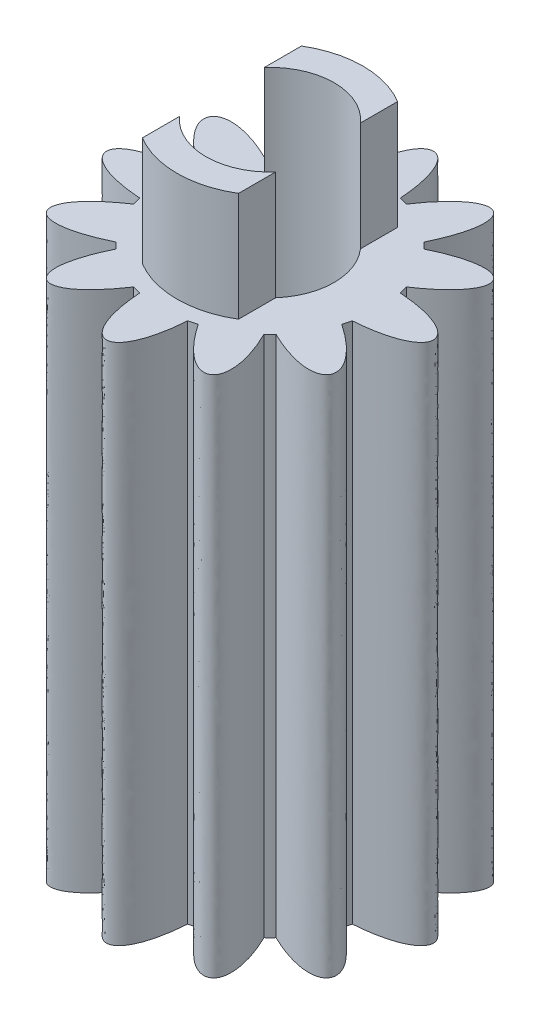
ISO-10303-21;
HEADER;
FILE_DESCRIPTION(('STEP AP214'),'2;1');
FILE_NAME('part.step','',(''),(''),'','','');
FILE_SCHEMA(('AUTOMOTIVE_DESIGN { 1 0 10303 214 1 1 1 1 }'));
ENDSEC;
DATA;
#1=APPLICATION_CONTEXT('core data for automotive mechanical design processes');
#2=APPLICATION_PROTOCOL_DEFINITION('international standard','automotive_design',2000,#1);
#3=PRODUCT_CONTEXT('',#1,'mechanical');
#4=PRODUCT('Part','Part','',(#3));
#5=PRODUCT_RELATED_PRODUCT_CATEGORY('part','',(#4));
#6=PRODUCT_DEFINITION_FORMATION('','',#4);
#7=PRODUCT_DEFINITION_CONTEXT('part definition',#1,'design');
#8=PRODUCT_DEFINITION('design','',#6,#7);
#9=PRODUCT_DEFINITION_SHAPE('','',#8);
#10=(LENGTH_UNIT() NAMED_UNIT(*) SI_UNIT(.MILLI.,.METRE.));
#11=(NAMED_UNIT(*) PLANE_ANGLE_UNIT() SI_UNIT($,.RADIAN.));
#12=(NAMED_UNIT(*) SI_UNIT($,.STERADIAN.) SOLID_ANGLE_UNIT());
#13=UNCERTAINTY_MEASURE_WITH_UNIT(LENGTH_MEASURE(1.E-05),#10,'distance_accuracy_value','');
#14=(GEOMETRIC_REPRESENTATION_CONTEXT(3) GLOBAL_UNCERTAINTY_ASSIGNED_CONTEXT((#13)) GLOBAL_UNIT_ASSIGNED_CONTEXT((#10,
#11,#12)) REPRESENTATION_CONTEXT('',''));
#15=CARTESIAN_POINT('',(0.,0.,0.));
#16=DIRECTION('',(0.,0.,1.));
#17=DIRECTION('',(1.,0.,0.));
#18=AXIS2_PLACEMENT_3D('',#15,#16,#17);
#19=CARTESIAN_POINT('',(0.,19.7,0.));
#20=DIRECTION('',(0.,-1.,0.));
#21=DIRECTION('',(0.,0.,-1.));
#22=AXIS2_PLACEMENT_3D('',#19,#20,#21);
#23=CYLINDRICAL_SURFACE('',#22,2.9);
#24=DIRECTION('',(0.,-1.,0.));
#25=VECTOR('',#24,1.);
#26=CARTESIAN_POINT('',(-1.5,19.7,-2.48193472919817));
#27=LINE('',#26,#25);
#28=CARTESIAN_POINT('',(-1.5,19.7,-2.48193472919817));
#29=VERTEX_POINT('',#28);
#30=CARTESIAN_POINT('',(-1.5,16.3,-2.48193472919817));
#31=VERTEX_POINT('',#30);
#32=EDGE_CURVE('E278',#29,#31,#27,.T.);
#33=ORIENTED_EDGE('',*,*,#32,.F.);
#34=CARTESIAN_POINT('',(0.,19.7,0.));
#35=DIRECTION('',(0.,1.,0.));
#36=DIRECTION('',(0.,0.,1.));
#37=AXIS2_PLACEMENT_3D('',#34,#35,#36);
#38=CIRCLE('',#37,2.9);
#39=CARTESIAN_POINT('',(1.5,19.7,-2.48193472919817));
#40=VERTEX_POINT('',#39);
#41=EDGE_CURVE('E270',#40,#29,#38,.T.);
#42=ORIENTED_EDGE('',*,*,#41,.F.);
#43=DIRECTION('',(0.,-1.,0.));
#44=VECTOR('',#43,1.);
#45=CARTESIAN_POINT('',(1.5,19.7,-2.48193472919817));
#46=LINE('',#45,#44);
#47=CARTESIAN_POINT('',(1.5,16.3,-2.48193472919817));
#48=VERTEX_POINT('',#47);
#49=EDGE_CURVE('E253',#48,#40,#46,.F.);
#50=ORIENTED_EDGE('',*,*,#49,.F.);
#51=CARTESIAN_POINT('',(0.,16.3,0.));
#52=DIRECTION('',(0.,1.,0.));
#53=DIRECTION('',(0.,0.,1.));
#54=AXIS2_PLACEMENT_3D('',#51,#52,#53);
#55=CIRCLE('',#54,2.9);
#56=EDGE_CURVE('E300',#48,#31,#55,.T.);
#57=ORIENTED_EDGE('',*,*,#56,.T.);
#58=EDGE_LOOP('',(#33,#42,#50,#57));
#59=FACE_BOUND('',#58,.T.);
#60=ADVANCED_FACE('F45',(#59),#23,.T.);
#61=DIRECTION('',(0.,-1.,0.));
#62=VECTOR('',#61,1.);
#63=CARTESIAN_POINT('',(-1.5,19.7,2.48193472919817));
#64=LINE('',#63,#62);
#65=CARTESIAN_POINT('',(-1.5,16.3,2.48193472919817));
#66=VERTEX_POINT('',#65);
#67=CARTESIAN_POINT('',(-1.5,19.7,2.48193472919817));
#68=VERTEX_POINT('',#67);
#69=EDGE_CURVE('E703',#66,#68,#64,.F.);
#70=ORIENTED_EDGE('',*,*,#69,.F.);
#71=CARTESIAN_POINT('',(1.5,16.3,2.48193472919817));
#72=VERTEX_POINT('',#71);
#73=EDGE_CURVE('E296',#66,#72,#55,.T.);
#74=ORIENTED_EDGE('',*,*,#73,.T.);
#75=DIRECTION('',(0.,-1.,0.));
#76=VECTOR('',#75,1.);
#77=CARTESIAN_POINT('',(1.5,19.7,2.48193472919817));
#78=LINE('',#77,#76);
#79=CARTESIAN_POINT('',(1.5,19.7,2.48193472919817));
#80=VERTEX_POINT('',#79);
#81=EDGE_CURVE('E262',#80,#72,#78,.T.);
#82=ORIENTED_EDGE('',*,*,#81,.F.);
#83=EDGE_CURVE('E281',#68,#80,#38,.T.);
#84=ORIENTED_EDGE('',*,*,#83,.F.);
#85=EDGE_LOOP('',(#70,#74,#82,#84));
#86=FACE_BOUND('',#85,.T.);
#87=ADVANCED_FACE('F841',(#86),#23,.T.);
#88=CARTESIAN_POINT('',(0.,19.7,0.));
#89=DIRECTION('',(0.,1.,0.));
#90=DIRECTION('',(0.,0.,1.));
#91=AXIS2_PLACEMENT_3D('',#88,#89,#90);
#92=PLANE('',#91);
#93=ORIENTED_EDGE('',*,*,#41,.T.);
#94=DIRECTION('',(0.,0.,-1.));
#95=VECTOR('',#94,1.);
#96=CARTESIAN_POINT('',(-1.5,19.7,-6.));
#97=LINE('',#96,#95);
#98=CARTESIAN_POINT('',(-1.5,19.7,-1.3228756555323));
#99=VERTEX_POINT('',#98);
#100=EDGE_CURVE('E693',#99,#29,#97,.T.);
#101=ORIENTED_EDGE('',*,*,#100,.F.);
#102=CARTESIAN_POINT('',(0.,19.7,0.));
#103=DIRECTION('',(0.,-1.,0.));
#104=DIRECTION('',(0.,0.,-1.));
#105=AXIS2_PLACEMENT_3D('',#102,#103,#104);
#106=CIRCLE('',#105,2.);
#107=CARTESIAN_POINT('',(1.5,19.7,-1.3228756555323));
#108=VERTEX_POINT('',#107);
#109=EDGE_CURVE('E272',#99,#108,#106,.T.);
#110=ORIENTED_EDGE('',*,*,#109,.T.);
#111=DIRECTION('',(0.,0.,1.));
#112=VECTOR('',#111,1.);
#113=CARTESIAN_POINT('',(1.5,19.7,-6.));
#114=LINE('',#113,#112);
#115=EDGE_CURVE('E256',#40,#108,#114,.T.);
#116=ORIENTED_EDGE('',*,*,#115,.F.);
#117=EDGE_LOOP('',(#93,#101,#110,#116));
#118=FACE_BOUND('',#117,.T.);
#119=ADVANCED_FACE('F268',(#118),#92,.T.);
#120=CARTESIAN_POINT('',(1.5,19.7,1.3228756555323));
#121=VERTEX_POINT('',#120);
#122=CARTESIAN_POINT('',(-1.5,19.7,1.3228756555323));
#123=VERTEX_POINT('',#122);
#124=EDGE_CURVE('E291',#121,#123,#106,.T.);
#125=ORIENTED_EDGE('',*,*,#124,.T.);
#126=EDGE_CURVE('E263',#68,#123,#97,.T.);
#127=ORIENTED_EDGE('',*,*,#126,.F.);
#128=ORIENTED_EDGE('',*,*,#83,.T.);
#129=EDGE_CURVE('E275',#121,#80,#114,.T.);
#130=ORIENTED_EDGE('',*,*,#129,.F.);
#131=EDGE_LOOP('',(#125,#127,#128,#130));
#132=FACE_BOUND('',#131,.T.);
#133=ADVANCED_FACE('F927',(#132),#92,.T.);
#134=CARTESIAN_POINT('',(0.,19.7,0.));
#135=DIRECTION('',(0.,-1.,0.));
#136=DIRECTION('',(0.,0.,-1.));
#137=AXIS2_PLACEMENT_3D('',#134,#135,#136);
#138=CYLINDRICAL_SURFACE('',#137,2.);
#139=CARTESIAN_POINT('',(0.,0.,0.));
#140=DIRECTION('',(0.,-1.,0.));
#141=DIRECTION('',(0.,0.,-1.));
#142=AXIS2_PLACEMENT_3D('',#139,#140,#141);
#143=CIRCLE('',#142,2.);
#144=CARTESIAN_POINT('',(0.,0.,-2.));
#145=VERTEX_POINT('',#144);
#146=EDGE_CURVE('E294',#145,#145,#143,.T.);
#147=ORIENTED_EDGE('',*,*,#146,.T.);
#148=EDGE_LOOP('',(#147));
#149=FACE_BOUND('',#148,.T.);
#150=DIRECTION('',(0.,-1.,0.));
#151=VECTOR('',#150,1.);
#152=CARTESIAN_POINT('',(-1.5,19.7,-1.3228756555323));
#153=LINE('',#152,#151);
#154=CARTESIAN_POINT('',(-1.5,16.3,-1.3228756555323));
#155=VERTEX_POINT('',#154);
#156=EDGE_CURVE('E11',#155,#99,#153,.F.);
#157=ORIENTED_EDGE('',*,*,#156,.F.);
#158=CARTESIAN_POINT('',(0.,16.3,0.));
#159=DIRECTION('',(0.,-1.,0.));
#160=DIRECTION('',(0.,0.,-1.));
#161=AXIS2_PLACEMENT_3D('',#158,#159,#160);
#162=CIRCLE('',#161,2.);
#163=CARTESIAN_POINT('',(-1.5,16.3,1.3228756555323));
#164=VERTEX_POINT('',#163);
#165=EDGE_CURVE('E669',#155,#164,#162,.F.);
#166=ORIENTED_EDGE('',*,*,#165,.T.);
#167=DIRECTION('',(0.,-1.,0.));
#168=VECTOR('',#167,1.);
#169=CARTESIAN_POINT('',(-1.5,19.7,1.3228756555323));
#170=LINE('',#169,#168);
#171=EDGE_CURVE('E55',#123,#164,#170,.T.);
#172=ORIENTED_EDGE('',*,*,#171,.F.);
#173=ORIENTED_EDGE('',*,*,#124,.F.);
#174=DIRECTION('',(0.,-1.,0.));
#175=VECTOR('',#174,1.);
#176=CARTESIAN_POINT('',(1.5,19.7,1.3228756555323));
#177=LINE('',#176,#175);
#178=CARTESIAN_POINT('',(1.5,16.3,1.3228756555323));
#179=VERTEX_POINT('',#178);
#180=EDGE_CURVE('E666',#179,#121,#177,.F.);
#181=ORIENTED_EDGE('',*,*,#180,.F.);
#182=CARTESIAN_POINT('',(0.,16.3,0.));
#183=DIRECTION('',(0.,-1.,0.));
#184=DIRECTION('',(0.,0.,-1.));
#185=AXIS2_PLACEMENT_3D('',#182,#183,#184);
#186=CIRCLE('',#185,2.);
#187=CARTESIAN_POINT('',(1.5,16.3,-1.3228756555323));
#188=VERTEX_POINT('',#187);
#189=EDGE_CURVE('E659',#179,#188,#186,.F.);
#190=ORIENTED_EDGE('',*,*,#189,.T.);
#191=DIRECTION('',(0.,-1.,0.));
#192=VECTOR('',#191,1.);
#193=CARTESIAN_POINT('',(1.5,19.7,-1.3228756555323));
#194=LINE('',#193,#192);
#195=EDGE_CURVE('E663',#108,#188,#194,.T.);
#196=ORIENTED_EDGE('',*,*,#195,.F.);
#197=ORIENTED_EDGE('',*,*,#109,.F.);
#198=EDGE_LOOP('',(#157,#166,#172,#173,#181,#190,#196,#197));
#199=FACE_BOUND('',#198,.T.);
#200=ADVANCED_FACE('F682',(#149,#199),#138,.F.);
#201=CARTESIAN_POINT('',(0.,16.3,0.));
#202=DIRECTION('',(0.,-1.,0.));
#203=DIRECTION('',(0.,0.,-1.));
#204=AXIS2_PLACEMENT_3D('',#201,#202,#203);
#205=CYLINDRICAL_SURFACE('',#204,3.4);
#206=CARTESIAN_POINT('',(0.,0.,0.));
#207=DIRECTION('',(0.,1.,0.));
#208=DIRECTION('',(0.,0.,1.));
#209=AXIS2_PLACEMENT_3D('',#206,#207,#208);
#210=CIRCLE('',#209,3.4);
#211=CARTESIAN_POINT('',(0.749999999999977,0.,3.31624787975809));
#212=VERTEX_POINT('',#211);
#213=CARTESIAN_POINT('',(1.0086048870407,0.,3.24695490911679));
#214=VERTEX_POINT('',#213);
#215=EDGE_CURVE('E280',#212,#214,#210,.T.);
#216=ORIENTED_EDGE('',*,*,#215,.T.);
#217=DIRECTION('',(0.,-1.,0.));
#218=VECTOR('',#217,1.);
#219=CARTESIAN_POINT('',(1.0086048870407,16.3,3.24695490911679));
#220=LINE('',#219,#218);
#221=CARTESIAN_POINT('',(1.0086048870407,16.3,3.24695490911679));
#222=VERTEX_POINT('',#221);
#223=EDGE_CURVE('E301',#222,#214,#220,.T.);
#224=ORIENTED_EDGE('',*,*,#223,.F.);
#225=CARTESIAN_POINT('',(0.,16.3,0.));
#226=DIRECTION('',(0.,1.,0.));
#227=DIRECTION('',(0.,0.,1.));
#228=AXIS2_PLACEMENT_3D('',#225,#226,#227);
#229=CIRCLE('',#228,3.4);
#230=CARTESIAN_POINT('',(0.749999999999977,16.3,3.31624787975809));
#231=VERTEX_POINT('',#230);
#232=EDGE_CURVE('E302',#231,#222,#229,.T.);
#233=ORIENTED_EDGE('',*,*,#232,.F.);
#234=DIRECTION('',(0.,-1.,0.));
#235=VECTOR('',#234,1.);
#236=CARTESIAN_POINT('',(0.749999999999977,16.3,3.31624787975809));
#237=LINE('',#236,#235);
#238=EDGE_CURVE('E469',#231,#212,#237,.T.);
#239=ORIENTED_EDGE('',*,*,#238,.T.);
#240=EDGE_LOOP('',(#216,#224,#233,#239));
#241=FACE_BOUND('',#240,.T.);
#242=ADVANCED_FACE('F456',(#241),#205,.T.);
#243=CARTESIAN_POINT('',(2.30764299271736,16.3,2.4969549091168));
#244=CARTESIAN_POINT('',(3.35247350558122,16.3,4.63998777602861));
#245=CARTESIAN_POINT('',(2.34211053449937,16.3,5.22332110936194));
#246=CARTESIAN_POINT('',(1.0086048870407,16.3,3.24695490911679));
#247=B_SPLINE_CURVE_WITH_KNOTS('',3,(#243,#244,#245,#246),.UNSPECIFIED.,.F.,.F.,(4,4),(0.,1.),.UNSPECIFIED.);
#248=DIRECTION('',(0.,-1.,0.));
#249=VECTOR('',#248,1.);
#250=SURFACE_OF_LINEAR_EXTRUSION('',#247,#249);
#251=CARTESIAN_POINT('',(2.30764299271736,0.,2.4969549091168));
#252=CARTESIAN_POINT('',(3.35247350558122,0.,4.63998777602861));
#253=CARTESIAN_POINT('',(2.34211053449937,0.,5.22332110936194));
#254=CARTESIAN_POINT('',(1.0086048870407,0.,3.24695490911679));
#255=B_SPLINE_CURVE_WITH_KNOTS('',3,(#251,#252,#253,#254),.UNSPECIFIED.,.F.,.F.,(4,4),(0.,1.),.UNSPECIFIED.);
#256=CARTESIAN_POINT('',(2.30764299271736,0.,2.4969549091168));
#257=VERTEX_POINT('',#256);
#258=EDGE_CURVE('E286',#257,#214,#255,.T.);
#259=ORIENTED_EDGE('',*,*,#258,.F.);
#260=DIRECTION('',(0.,-1.,0.));
#261=VECTOR('',#260,1.);
#262=CARTESIAN_POINT('',(2.30764299271736,16.3,2.4969549091168));
#263=LINE('',#262,#261);
#264=CARTESIAN_POINT('',(2.30764299271736,16.3,2.4969549091168));
#265=VERTEX_POINT('',#264);
#266=EDGE_CURVE('E654',#265,#257,#263,.T.);
#267=ORIENTED_EDGE('',*,*,#266,.F.);
#268=EDGE_CURVE('E305',#265,#222,#247,.T.);
#269=ORIENTED_EDGE('',*,*,#268,.T.);
#270=ORIENTED_EDGE('',*,*,#223,.T.);
#271=EDGE_LOOP('',(#259,#267,#269,#270));
#272=FACE_BOUND('',#271,.T.);
#273=ADVANCED_FACE('F47',(#272),#250,.T.);
#274=CARTESIAN_POINT('',(2.49695490911677,0.,2.30764299271738));
#275=VERTEX_POINT('',#274);
#276=EDGE_CURVE('E289',#257,#275,#210,.T.);
#277=ORIENTED_EDGE('',*,*,#276,.T.);
#278=DIRECTION('',(0.,-1.,0.));
#279=VECTOR('',#278,1.);
#280=CARTESIAN_POINT('',(2.49695490911677,16.3,2.30764299271738));
#281=LINE('',#280,#279);
#282=CARTESIAN_POINT('',(2.49695490911677,16.3,2.30764299271738));
#283=VERTEX_POINT('',#282);
#284=EDGE_CURVE('E651',#283,#275,#281,.T.);
#285=ORIENTED_EDGE('',*,*,#284,.F.);
#286=EDGE_CURVE('E308',#265,#283,#229,.T.);
#287=ORIENTED_EDGE('',*,*,#286,.F.);
#288=ORIENTED_EDGE('',*,*,#266,.T.);
#289=EDGE_LOOP('',(#277,#285,#287,#288));
#290=FACE_BOUND('',#289,.T.);
#291=ADVANCED_FACE('F336',(#290),#205,.T.);
#292=CARTESIAN_POINT('',(3.24695490911678,16.3,1.00860488704073));
#293=CARTESIAN_POINT('',(5.22332110936191,16.3,2.34211053449942));
#294=CARTESIAN_POINT('',(4.63998777602857,16.3,3.35247350558126));
#295=CARTESIAN_POINT('',(2.49695490911677,16.3,2.30764299271738));
#296=B_SPLINE_CURVE_WITH_KNOTS('',3,(#292,#293,#294,#295),.UNSPECIFIED.,.F.,.F.,(4,4),(0.,1.),.UNSPECIFIED.);
#297=DIRECTION('',(0.,-1.,0.));
#298=VECTOR('',#297,1.);
#299=SURFACE_OF_LINEAR_EXTRUSION('',#296,#298);
#300=CARTESIAN_POINT('',(3.24695490911678,0.,1.00860488704073));
#301=CARTESIAN_POINT('',(5.22332110936191,0.,2.34211053449942));
#302=CARTESIAN_POINT('',(4.63998777602857,0.,3.35247350558126));
#303=CARTESIAN_POINT('',(2.49695490911677,0.,2.30764299271738));
#304=B_SPLINE_CURVE_WITH_KNOTS('',3,(#300,#301,#302,#303),.UNSPECIFIED.,.F.,.F.,(4,4),(0.,1.),.UNSPECIFIED.);
#305=CARTESIAN_POINT('',(3.24695490911678,0.,1.00860488704073));
#306=VERTEX_POINT('',#305);
#307=EDGE_CURVE('E479',#306,#275,#304,.T.);
#308=ORIENTED_EDGE('',*,*,#307,.F.);
#309=DIRECTION('',(0.,-1.,0.));
#310=VECTOR('',#309,1.);
#311=CARTESIAN_POINT('',(3.24695490911678,16.3,1.00860488704073));
#312=LINE('',#311,#310);
#313=CARTESIAN_POINT('',(3.24695490911678,16.3,1.00860488704073));
#314=VERTEX_POINT('',#313);
#315=EDGE_CURVE('E648',#314,#306,#312,.T.);
#316=ORIENTED_EDGE('',*,*,#315,.F.);
#317=EDGE_CURVE('E314',#314,#283,#296,.T.);
#318=ORIENTED_EDGE('',*,*,#317,.T.);
#319=ORIENTED_EDGE('',*,*,#284,.T.);
#320=EDGE_LOOP('',(#308,#316,#318,#319));
#321=FACE_BOUND('',#320,.T.);
#322=ADVANCED_FACE('F332',(#321),#299,.T.);
#323=CARTESIAN_POINT('',(3.31624787975808,0.,0.750000000000012));
#324=VERTEX_POINT('',#323);
#325=EDGE_CURVE('E488',#306,#324,#210,.T.);
#326=ORIENTED_EDGE('',*,*,#325,.T.);
#327=DIRECTION('',(0.,-1.,0.));
#328=VECTOR('',#327,1.);
#329=CARTESIAN_POINT('',(3.31624787975808,16.3,0.750000000000012));
#330=LINE('',#329,#328);
#331=CARTESIAN_POINT('',(3.31624787975808,16.3,0.750000000000012));
#332=VERTEX_POINT('',#331);
#333=EDGE_CURVE('E645',#332,#324,#330,.T.);
#334=ORIENTED_EDGE('',*,*,#333,.F.);
#335=EDGE_CURVE('E323',#314,#332,#229,.T.);
#336=ORIENTED_EDGE('',*,*,#335,.F.);
#337=ORIENTED_EDGE('',*,*,#315,.T.);
#338=EDGE_LOOP('',(#326,#334,#336,#337));
#339=FACE_BOUND('',#338,.T.);
#340=ADVANCED_FACE('F335',(#339),#205,.T.);
#341=CARTESIAN_POINT('',(3.31624787975809,16.3,-0.749999999999988));
#342=CARTESIAN_POINT('',(5.69458404008064,16.3,-0.583333333333314));
#343=CARTESIAN_POINT('',(5.69458404008063,16.3,0.583333333333354));
#344=CARTESIAN_POINT('',(3.31624787975808,16.3,0.750000000000011));
#345=B_SPLINE_CURVE_WITH_KNOTS('',3,(#341,#342,#343,#344),.UNSPECIFIED.,.F.,.F.,(4,4),(0.,1.),.UNSPECIFIED.);
#346=DIRECTION('',(0.,-1.,0.));
#347=VECTOR('',#346,1.);
#348=SURFACE_OF_LINEAR_EXTRUSION('',#345,#347);
#349=CARTESIAN_POINT('',(3.31624787975809,0.,-0.749999999999988));
#350=CARTESIAN_POINT('',(5.69458404008064,0.,-0.583333333333314));
#351=CARTESIAN_POINT('',(5.69458404008063,0.,0.583333333333354));
#352=CARTESIAN_POINT('',(3.31624787975808,0.,0.750000000000011));
#353=B_SPLINE_CURVE_WITH_KNOTS('',3,(#349,#350,#351,#352),.UNSPECIFIED.,.F.,.F.,(4,4),(0.,1.),.UNSPECIFIED.);
#354=CARTESIAN_POINT('',(3.31624787975809,0.,-0.749999999999988));
#355=VERTEX_POINT('',#354);
#356=EDGE_CURVE('E489',#355,#324,#353,.T.);
#357=ORIENTED_EDGE('',*,*,#356,.F.);
#358=DIRECTION('',(0.,-1.,0.));
#359=VECTOR('',#358,1.);
#360=CARTESIAN_POINT('',(3.31624787975809,16.3,-0.749999999999988));
#361=LINE('',#360,#359);
#362=CARTESIAN_POINT('',(3.31624787975809,16.3,-0.749999999999988));
#363=VERTEX_POINT('',#362);
#364=EDGE_CURVE('E642',#363,#355,#361,.T.);
#365=ORIENTED_EDGE('',*,*,#364,.F.);
#366=EDGE_CURVE('E324',#363,#332,#345,.T.);
#367=ORIENTED_EDGE('',*,*,#366,.T.);
#368=ORIENTED_EDGE('',*,*,#333,.T.);
#369=EDGE_LOOP('',(#357,#365,#367,#368));
#370=FACE_BOUND('',#369,.T.);
#371=ADVANCED_FACE('F338',(#370),#348,.T.);
#372=CARTESIAN_POINT('',(3.24695490911679,0.,-1.00860488704071));
#373=VERTEX_POINT('',#372);
#374=EDGE_CURVE('E498',#355,#373,#210,.T.);
#375=ORIENTED_EDGE('',*,*,#374,.T.);
#376=DIRECTION('',(0.,-1.,0.));
#377=VECTOR('',#376,1.);
#378=CARTESIAN_POINT('',(3.24695490911679,16.3,-1.00860488704071));
#379=LINE('',#378,#377);
#380=CARTESIAN_POINT('',(3.24695490911679,16.3,-1.00860488704071));
#381=VERTEX_POINT('',#380);
#382=EDGE_CURVE('E639',#381,#373,#379,.T.);
#383=ORIENTED_EDGE('',*,*,#382,.F.);
#384=EDGE_CURVE('E357',#363,#381,#229,.T.);
#385=ORIENTED_EDGE('',*,*,#384,.F.);
#386=ORIENTED_EDGE('',*,*,#364,.T.);
#387=EDGE_LOOP('',(#375,#383,#385,#386));
#388=FACE_BOUND('',#387,.T.);
#389=ADVANCED_FACE('F341',(#388),#205,.T.);
#390=CARTESIAN_POINT('',(2.49695490911679,16.3,-2.30764299271737));
#391=CARTESIAN_POINT('',(4.63998777602859,16.3,-3.35247350558123));
#392=CARTESIAN_POINT('',(5.22332110936193,16.3,-2.34211053449938));
#393=CARTESIAN_POINT('',(3.24695490911678,16.3,-1.00860488704071));
#394=B_SPLINE_CURVE_WITH_KNOTS('',3,(#390,#391,#392,#393),.UNSPECIFIED.,.F.,.F.,(4,4),(0.,1.),.UNSPECIFIED.);
#395=DIRECTION('',(0.,-1.,0.));
#396=VECTOR('',#395,1.);
#397=SURFACE_OF_LINEAR_EXTRUSION('',#394,#396);
#398=CARTESIAN_POINT('',(2.49695490911679,0.,-2.30764299271737));
#399=CARTESIAN_POINT('',(4.63998777602859,0.,-3.35247350558123));
#400=CARTESIAN_POINT('',(5.22332110936193,0.,-2.34211053449938));
#401=CARTESIAN_POINT('',(3.24695490911678,0.,-1.00860488704071));
#402=B_SPLINE_CURVE_WITH_KNOTS('',3,(#398,#399,#400,#401),.UNSPECIFIED.,.F.,.F.,(4,4),(0.,1.),.UNSPECIFIED.);
#403=CARTESIAN_POINT('',(2.49695490911679,0.,-2.30764299271737));
#404=VERTEX_POINT('',#403);
#405=EDGE_CURVE('E499',#404,#373,#402,.T.);
#406=ORIENTED_EDGE('',*,*,#405,.F.);
#407=DIRECTION('',(0.,-1.,0.));
#408=VECTOR('',#407,1.);
#409=CARTESIAN_POINT('',(2.49695490911679,16.3,-2.30764299271737));
#410=LINE('',#409,#408);
#411=CARTESIAN_POINT('',(2.49695490911679,16.3,-2.30764299271737));
#412=VERTEX_POINT('',#411);
#413=EDGE_CURVE('E636',#412,#404,#410,.T.);
#414=ORIENTED_EDGE('',*,*,#413,.F.);
#415=EDGE_CURVE('E351',#412,#381,#394,.T.);
#416=ORIENTED_EDGE('',*,*,#415,.T.);
#417=ORIENTED_EDGE('',*,*,#382,.T.);
#418=EDGE_LOOP('',(#406,#414,#416,#417));
#419=FACE_BOUND('',#418,.T.);
#420=ADVANCED_FACE('F343',(#419),#397,.T.);
#421=CARTESIAN_POINT('',(2.30764299271737,0.,-2.49695490911678));
#422=VERTEX_POINT('',#421);
#423=EDGE_CURVE('E508',#404,#422,#210,.T.);
#424=ORIENTED_EDGE('',*,*,#423,.T.);
#425=DIRECTION('',(0.,-1.,0.));
#426=VECTOR('',#425,1.);
#427=CARTESIAN_POINT('',(2.30764299271737,16.3,-2.49695490911678));
#428=LINE('',#427,#426);
#429=CARTESIAN_POINT('',(2.30764299271737,16.3,-2.49695490911678));
#430=VERTEX_POINT('',#429);
#431=EDGE_CURVE('E633',#430,#422,#428,.T.);
#432=ORIENTED_EDGE('',*,*,#431,.F.);
#433=EDGE_CURVE('E356',#412,#430,#229,.T.);
#434=ORIENTED_EDGE('',*,*,#433,.F.);
#435=ORIENTED_EDGE('',*,*,#413,.T.);
#436=EDGE_LOOP('',(#424,#432,#434,#435));
#437=FACE_BOUND('',#436,.T.);
#438=ADVANCED_FACE('F346',(#437),#205,.T.);
#439=CARTESIAN_POINT('',(1.00860488704072,16.3,-3.24695490911678));
#440=CARTESIAN_POINT('',(2.3421105344994,16.3,-5.22332110936192));
#441=CARTESIAN_POINT('',(3.35247350558125,16.3,-4.63998777602858));
#442=CARTESIAN_POINT('',(2.30764299271737,16.3,-2.49695490911678));
#443=B_SPLINE_CURVE_WITH_KNOTS('',3,(#439,#440,#441,#442),.UNSPECIFIED.,.F.,.F.,(4,4),(0.,1.),.UNSPECIFIED.);
#444=DIRECTION('',(0.,-1.,0.));
#445=VECTOR('',#444,1.);
#446=SURFACE_OF_LINEAR_EXTRUSION('',#443,#445);
#447=CARTESIAN_POINT('',(1.00860488704072,0.,-3.24695490911678));
#448=CARTESIAN_POINT('',(2.3421105344994,0.,-5.22332110936192));
#449=CARTESIAN_POINT('',(3.35247350558125,0.,-4.63998777602858));
#450=CARTESIAN_POINT('',(2.30764299271737,0.,-2.49695490911678));
#451=B_SPLINE_CURVE_WITH_KNOTS('',3,(#447,#448,#449,#450),.UNSPECIFIED.,.F.,.F.,(4,4),(0.,1.),.UNSPECIFIED.);
#452=CARTESIAN_POINT('',(1.00860488704072,0.,-3.24695490911678));
#453=VERTEX_POINT('',#452);
#454=EDGE_CURVE('E509',#453,#422,#451,.T.);
#455=ORIENTED_EDGE('',*,*,#454,.F.);
#456=DIRECTION('',(0.,-1.,0.));
#457=VECTOR('',#456,1.);
#458=CARTESIAN_POINT('',(1.00860488704072,16.3,-3.24695490911678));
#459=LINE('',#458,#457);
#460=CARTESIAN_POINT('',(1.00860488704072,16.3,-3.24695490911678));
#461=VERTEX_POINT('',#460);
#462=EDGE_CURVE('E630',#461,#453,#459,.T.);
#463=ORIENTED_EDGE('',*,*,#462,.F.);
#464=EDGE_CURVE('E358',#461,#430,#443,.T.);
#465=ORIENTED_EDGE('',*,*,#464,.T.);
#466=ORIENTED_EDGE('',*,*,#431,.T.);
#467=EDGE_LOOP('',(#455,#463,#465,#466));
#468=FACE_BOUND('',#467,.T.);
#469=ADVANCED_FACE('F348',(#468),#446,.T.);
#470=CARTESIAN_POINT('',(0.75,0.,-3.31624787975809));
#471=VERTEX_POINT('',#470);
#472=EDGE_CURVE('E518',#453,#471,#210,.T.);
#473=ORIENTED_EDGE('',*,*,#472,.T.);
#474=DIRECTION('',(0.,-1.,0.));
#475=VECTOR('',#474,1.);
#476=CARTESIAN_POINT('',(0.75,16.3,-3.31624787975809));
#477=LINE('',#476,#475);
#478=CARTESIAN_POINT('',(0.75,16.3,-3.31624787975809));
#479=VERTEX_POINT('',#478);
#480=EDGE_CURVE('E627',#479,#471,#477,.T.);
#481=ORIENTED_EDGE('',*,*,#480,.F.);
#482=EDGE_CURVE('E367',#461,#479,#229,.T.);
#483=ORIENTED_EDGE('',*,*,#482,.F.);
#484=ORIENTED_EDGE('',*,*,#462,.T.);
#485=EDGE_LOOP('',(#473,#481,#483,#484));
#486=FACE_BOUND('',#485,.T.);
#487=ADVANCED_FACE('F391',(#486),#205,.T.);
#488=CARTESIAN_POINT('',(-0.75,16.3,-3.31624787975809));
#489=CARTESIAN_POINT('',(-0.583333333333333,16.3,-5.69458404008064));
#490=CARTESIAN_POINT('',(0.583333333333334,16.3,-5.69458404008064));
#491=CARTESIAN_POINT('',(0.75,16.3,-3.31624787975808));
#492=B_SPLINE_CURVE_WITH_KNOTS('',3,(#488,#489,#490,#491),.UNSPECIFIED.,.F.,.F.,(4,4),(0.,1.),.UNSPECIFIED.);
#493=DIRECTION('',(0.,-1.,0.));
#494=VECTOR('',#493,1.);
#495=SURFACE_OF_LINEAR_EXTRUSION('',#492,#494);
#496=CARTESIAN_POINT('',(-0.75,0.,-3.31624787975809));
#497=CARTESIAN_POINT('',(-0.583333333333333,0.,-5.69458404008064));
#498=CARTESIAN_POINT('',(0.583333333333334,0.,-5.69458404008064));
#499=CARTESIAN_POINT('',(0.75,0.,-3.31624787975808));
#500=B_SPLINE_CURVE_WITH_KNOTS('',3,(#496,#497,#498,#499),.UNSPECIFIED.,.F.,.F.,(4,4),(0.,1.),.UNSPECIFIED.);
#501=CARTESIAN_POINT('',(-0.75,0.,-3.31624787975809));
#502=VERTEX_POINT('',#501);
#503=EDGE_CURVE('E519',#502,#471,#500,.T.);
#504=ORIENTED_EDGE('',*,*,#503,.F.);
#505=DIRECTION('',(0.,-1.,0.));
#506=VECTOR('',#505,1.);
#507=CARTESIAN_POINT('',(-0.75,16.3,-3.31624787975809));
#508=LINE('',#507,#506);
#509=CARTESIAN_POINT('',(-0.75,16.3,-3.31624787975809));
#510=VERTEX_POINT('',#509);
#511=EDGE_CURVE('E624',#510,#502,#508,.T.);
#512=ORIENTED_EDGE('',*,*,#511,.F.);
#513=EDGE_CURVE('E368',#510,#479,#492,.T.);
#514=ORIENTED_EDGE('',*,*,#513,.T.);
#515=ORIENTED_EDGE('',*,*,#480,.T.);
#516=EDGE_LOOP('',(#504,#512,#514,#515));
#517=FACE_BOUND('',#516,.T.);
#518=ADVANCED_FACE('F387',(#517),#495,.T.);
#519=CARTESIAN_POINT('',(-1.00860488704067,0.,-3.2469549091168));
#520=VERTEX_POINT('',#519);
#521=EDGE_CURVE('E528',#502,#520,#210,.T.);
#522=ORIENTED_EDGE('',*,*,#521,.T.);
#523=DIRECTION('',(0.,-1.,0.));
#524=VECTOR('',#523,1.);
#525=CARTESIAN_POINT('',(-1.00860488704067,16.3,-3.2469549091168));
#526=LINE('',#525,#524);
#527=CARTESIAN_POINT('',(-1.00860488704067,16.3,-3.2469549091168));
#528=VERTEX_POINT('',#527);
#529=EDGE_CURVE('E621',#528,#520,#526,.T.);
#530=ORIENTED_EDGE('',*,*,#529,.F.);
#531=EDGE_CURVE('E378',#510,#528,#229,.T.);
#532=ORIENTED_EDGE('',*,*,#531,.F.);
#533=ORIENTED_EDGE('',*,*,#511,.T.);
#534=EDGE_LOOP('',(#522,#530,#532,#533));
#535=FACE_BOUND('',#534,.T.);
#536=ADVANCED_FACE('F390',(#535),#205,.T.);
#537=CARTESIAN_POINT('',(-2.30764299271734,16.3,-2.49695490911681));
#538=CARTESIAN_POINT('',(-3.35247350558118,16.3,-4.63998777602863));
#539=CARTESIAN_POINT('',(-2.34211053449933,16.3,-5.22332110936195));
#540=CARTESIAN_POINT('',(-1.00860488704067,16.3,-3.2469549091168));
#541=B_SPLINE_CURVE_WITH_KNOTS('',3,(#537,#538,#539,#540),.UNSPECIFIED.,.F.,.F.,(4,4),(0.,1.),.UNSPECIFIED.);
#542=DIRECTION('',(0.,-1.,0.));
#543=VECTOR('',#542,1.);
#544=SURFACE_OF_LINEAR_EXTRUSION('',#541,#543);
#545=CARTESIAN_POINT('',(-2.30764299271734,0.,-2.49695490911681));
#546=CARTESIAN_POINT('',(-3.35247350558118,0.,-4.63998777602863));
#547=CARTESIAN_POINT('',(-2.34211053449933,0.,-5.22332110936195));
#548=CARTESIAN_POINT('',(-1.00860488704067,0.,-3.2469549091168));
#549=B_SPLINE_CURVE_WITH_KNOTS('',3,(#545,#546,#547,#548),.UNSPECIFIED.,.F.,.F.,(4,4),(0.,1.),.UNSPECIFIED.);
#550=CARTESIAN_POINT('',(-2.30764299271734,0.,-2.49695490911681));
#551=VERTEX_POINT('',#550);
#552=EDGE_CURVE('E529',#551,#520,#549,.T.);
#553=ORIENTED_EDGE('',*,*,#552,.F.);
#554=DIRECTION('',(0.,-1.,0.));
#555=VECTOR('',#554,1.);
#556=CARTESIAN_POINT('',(-2.30764299271734,16.3,-2.49695490911681));
#557=LINE('',#556,#555);
#558=CARTESIAN_POINT('',(-2.30764299271734,16.3,-2.49695490911681));
#559=VERTEX_POINT('',#558);
#560=EDGE_CURVE('E618',#559,#551,#557,.T.);
#561=ORIENTED_EDGE('',*,*,#560,.F.);
#562=EDGE_CURVE('E379',#559,#528,#541,.T.);
#563=ORIENTED_EDGE('',*,*,#562,.T.);
#564=ORIENTED_EDGE('',*,*,#529,.T.);
#565=EDGE_LOOP('',(#553,#561,#563,#564));
#566=FACE_BOUND('',#565,.T.);
#567=ADVANCED_FACE('F393',(#566),#544,.T.);
#568=CARTESIAN_POINT('',(-2.49695490911676,0.,-2.3076429927174));
#569=VERTEX_POINT('',#568);
#570=EDGE_CURVE('E538',#551,#569,#210,.T.);
#571=ORIENTED_EDGE('',*,*,#570,.T.);
#572=DIRECTION('',(0.,-1.,0.));
#573=VECTOR('',#572,1.);
#574=CARTESIAN_POINT('',(-2.49695490911676,16.3,-2.3076429927174));
#575=LINE('',#574,#573);
#576=CARTESIAN_POINT('',(-2.49695490911676,16.3,-2.3076429927174));
#577=VERTEX_POINT('',#576);
#578=EDGE_CURVE('E615',#577,#569,#575,.T.);
#579=ORIENTED_EDGE('',*,*,#578,.F.);
#580=EDGE_CURVE('E412',#559,#577,#229,.T.);
#581=ORIENTED_EDGE('',*,*,#580,.F.);
#582=ORIENTED_EDGE('',*,*,#560,.T.);
#583=EDGE_LOOP('',(#571,#579,#581,#582));
#584=FACE_BOUND('',#583,.T.);
#585=ADVANCED_FACE('F396',(#584),#205,.T.);
#586=CARTESIAN_POINT('',(-3.24695490911677,16.3,-1.00860488704075));
#587=CARTESIAN_POINT('',(-5.22332110936189,16.3,-2.34211053449946));
#588=CARTESIAN_POINT('',(-4.63998777602855,16.3,-3.3524735055813));
#589=CARTESIAN_POINT('',(-2.49695490911676,16.3,-2.3076429927174));
#590=B_SPLINE_CURVE_WITH_KNOTS('',3,(#586,#587,#588,#589),.UNSPECIFIED.,.F.,.F.,(4,4),(0.,1.),.UNSPECIFIED.);
#591=DIRECTION('',(0.,-1.,0.));
#592=VECTOR('',#591,1.);
#593=SURFACE_OF_LINEAR_EXTRUSION('',#590,#592);
#594=CARTESIAN_POINT('',(-3.24695490911677,0.,-1.00860488704075));
#595=CARTESIAN_POINT('',(-5.22332110936189,0.,-2.34211053449946));
#596=CARTESIAN_POINT('',(-4.63998777602855,0.,-3.3524735055813));
#597=CARTESIAN_POINT('',(-2.49695490911676,0.,-2.3076429927174));
#598=B_SPLINE_CURVE_WITH_KNOTS('',3,(#594,#595,#596,#597),.UNSPECIFIED.,.F.,.F.,(4,4),(0.,1.),.UNSPECIFIED.);
#599=CARTESIAN_POINT('',(-3.24695490911677,0.,-1.00860488704075));
#600=VERTEX_POINT('',#599);
#601=EDGE_CURVE('E539',#600,#569,#598,.T.);
#602=ORIENTED_EDGE('',*,*,#601,.F.);
#603=DIRECTION('',(0.,-1.,0.));
#604=VECTOR('',#603,1.);
#605=CARTESIAN_POINT('',(-3.24695490911677,16.3,-1.00860488704075));
#606=LINE('',#605,#604);
#607=CARTESIAN_POINT('',(-3.24695490911677,16.3,-1.00860488704075));
#608=VERTEX_POINT('',#607);
#609=EDGE_CURVE('E612',#608,#600,#606,.T.);
#610=ORIENTED_EDGE('',*,*,#609,.F.);
#611=EDGE_CURVE('E406',#608,#577,#590,.T.);
#612=ORIENTED_EDGE('',*,*,#611,.T.);
#613=ORIENTED_EDGE('',*,*,#578,.T.);
#614=EDGE_LOOP('',(#602,#610,#612,#613));
#615=FACE_BOUND('',#614,.T.);
#616=ADVANCED_FACE('F398',(#615),#593,.T.);
#617=CARTESIAN_POINT('',(-3.31624787975808,0.,-0.750000000000035));
#618=VERTEX_POINT('',#617);
#619=EDGE_CURVE('E548',#600,#618,#210,.T.);
#620=ORIENTED_EDGE('',*,*,#619,.T.);
#621=DIRECTION('',(0.,-1.,0.));
#622=VECTOR('',#621,1.);
#623=CARTESIAN_POINT('',(-3.31624787975808,16.3,-0.750000000000035));
#624=LINE('',#623,#622);
#625=CARTESIAN_POINT('',(-3.31624787975808,16.3,-0.750000000000035));
#626=VERTEX_POINT('',#625);
#627=EDGE_CURVE('E609',#626,#618,#624,.T.);
#628=ORIENTED_EDGE('',*,*,#627,.F.);
#629=EDGE_CURVE('E411',#608,#626,#229,.T.);
#630=ORIENTED_EDGE('',*,*,#629,.F.);
#631=ORIENTED_EDGE('',*,*,#609,.T.);
#632=EDGE_LOOP('',(#620,#628,#630,#631));
#633=FACE_BOUND('',#632,.T.);
#634=ADVANCED_FACE('F401',(#633),#205,.T.);
#635=CARTESIAN_POINT('',(-3.31624787975809,16.3,0.749999999999965));
#636=CARTESIAN_POINT('',(-5.69458404008064,16.3,0.583333333333274));
#637=CARTESIAN_POINT('',(-5.69458404008063,16.3,-0.583333333333394));
#638=CARTESIAN_POINT('',(-3.31624787975808,16.3,-0.750000000000035));
#639=B_SPLINE_CURVE_WITH_KNOTS('',3,(#635,#636,#637,#638),.UNSPECIFIED.,.F.,.F.,(4,4),(0.,1.),.UNSPECIFIED.);
#640=DIRECTION('',(0.,-1.,0.));
#641=VECTOR('',#640,1.);
#642=SURFACE_OF_LINEAR_EXTRUSION('',#639,#641);
#643=CARTESIAN_POINT('',(-3.31624787975809,0.,0.749999999999965));
#644=CARTESIAN_POINT('',(-5.69458404008064,0.,0.583333333333274));
#645=CARTESIAN_POINT('',(-5.69458404008063,0.,-0.583333333333394));
#646=CARTESIAN_POINT('',(-3.31624787975808,0.,-0.750000000000035));
#647=B_SPLINE_CURVE_WITH_KNOTS('',3,(#643,#644,#645,#646),.UNSPECIFIED.,.F.,.F.,(4,4),(0.,1.),.UNSPECIFIED.);
#648=CARTESIAN_POINT('',(-3.31624787975809,0.,0.749999999999966));
#649=VERTEX_POINT('',#648);
#650=EDGE_CURVE('E549',#649,#618,#647,.T.);
#651=ORIENTED_EDGE('',*,*,#650,.F.);
#652=DIRECTION('',(0.,-1.,0.));
#653=VECTOR('',#652,1.);
#654=CARTESIAN_POINT('',(-3.31624787975809,16.3,0.749999999999966));
#655=LINE('',#654,#653);
#656=CARTESIAN_POINT('',(-3.31624787975809,16.3,0.749999999999966));
#657=VERTEX_POINT('',#656);
#658=EDGE_CURVE('E606',#657,#649,#655,.T.);
#659=ORIENTED_EDGE('',*,*,#658,.F.);
#660=EDGE_CURVE('E413',#657,#626,#639,.T.);
#661=ORIENTED_EDGE('',*,*,#660,.T.);
#662=ORIENTED_EDGE('',*,*,#627,.T.);
#663=EDGE_LOOP('',(#651,#659,#661,#662));
#664=FACE_BOUND('',#663,.T.);
#665=ADVANCED_FACE('F403',(#664),#642,.T.);
#666=CARTESIAN_POINT('',(-3.24695490911679,0.,1.00860488704068));
#667=VERTEX_POINT('',#666);
#668=EDGE_CURVE('E558',#649,#667,#210,.T.);
#669=ORIENTED_EDGE('',*,*,#668,.T.);
#670=DIRECTION('',(0.,-1.,0.));
#671=VECTOR('',#670,1.);
#672=CARTESIAN_POINT('',(-3.24695490911679,16.3,1.00860488704068));
#673=LINE('',#672,#671);
#674=CARTESIAN_POINT('',(-3.24695490911679,16.3,1.00860488704068));
#675=VERTEX_POINT('',#674);
#676=EDGE_CURVE('E603',#675,#667,#673,.T.);
#677=ORIENTED_EDGE('',*,*,#676,.F.);
#678=EDGE_CURVE('E422',#657,#675,#229,.T.);
#679=ORIENTED_EDGE('',*,*,#678,.F.);
#680=ORIENTED_EDGE('',*,*,#658,.T.);
#681=EDGE_LOOP('',(#669,#677,#679,#680));
#682=FACE_BOUND('',#681,.T.);
#683=ADVANCED_FACE('F445',(#682),#205,.T.);
#684=CARTESIAN_POINT('',(-2.49695490911681,16.3,2.30764299271735));
#685=CARTESIAN_POINT('',(-4.63998777602862,16.3,3.3524735055812));
#686=CARTESIAN_POINT('',(-5.22332110936194,16.3,2.34211053449935));
#687=CARTESIAN_POINT('',(-3.24695490911679,16.3,1.00860488704068));
#688=B_SPLINE_CURVE_WITH_KNOTS('',3,(#684,#685,#686,#687),.UNSPECIFIED.,.F.,.F.,(4,4),(0.,1.),.UNSPECIFIED.);
#689=DIRECTION('',(0.,-1.,0.));
#690=VECTOR('',#689,1.);
#691=SURFACE_OF_LINEAR_EXTRUSION('',#688,#690);
#692=CARTESIAN_POINT('',(-2.49695490911681,0.,2.30764299271735));
#693=CARTESIAN_POINT('',(-4.63998777602862,0.,3.3524735055812));
#694=CARTESIAN_POINT('',(-5.22332110936194,0.,2.34211053449935));
#695=CARTESIAN_POINT('',(-3.24695490911679,0.,1.00860488704068));
#696=B_SPLINE_CURVE_WITH_KNOTS('',3,(#692,#693,#694,#695),.UNSPECIFIED.,.F.,.F.,(4,4),(0.,1.),.UNSPECIFIED.);
#697=CARTESIAN_POINT('',(-2.49695490911681,0.,2.30764299271735));
#698=VERTEX_POINT('',#697);
#699=EDGE_CURVE('E559',#698,#667,#696,.T.);
#700=ORIENTED_EDGE('',*,*,#699,.F.);
#701=DIRECTION('',(0.,-1.,0.));
#702=VECTOR('',#701,1.);
#703=CARTESIAN_POINT('',(-2.49695490911681,16.3,2.30764299271735));
#704=LINE('',#703,#702);
#705=CARTESIAN_POINT('',(-2.49695490911681,16.3,2.30764299271735));
#706=VERTEX_POINT('',#705);
#707=EDGE_CURVE('E600',#706,#698,#704,.T.);
#708=ORIENTED_EDGE('',*,*,#707,.F.);
#709=EDGE_CURVE('E423',#706,#675,#688,.T.);
#710=ORIENTED_EDGE('',*,*,#709,.T.);
#711=ORIENTED_EDGE('',*,*,#676,.T.);
#712=EDGE_LOOP('',(#700,#708,#710,#711));
#713=FACE_BOUND('',#712,.T.);
#714=ADVANCED_FACE('F441',(#713),#691,.T.);
#715=CARTESIAN_POINT('',(-2.30764299271739,0.,2.49695490911677));
#716=VERTEX_POINT('',#715);
#717=EDGE_CURVE('E568',#698,#716,#210,.T.);
#718=ORIENTED_EDGE('',*,*,#717,.T.);
#719=DIRECTION('',(0.,-1.,0.));
#720=VECTOR('',#719,1.);
#721=CARTESIAN_POINT('',(-2.30764299271739,16.3,2.49695490911677));
#722=LINE('',#721,#720);
#723=CARTESIAN_POINT('',(-2.30764299271739,16.3,2.49695490911677));
#724=VERTEX_POINT('',#723);
#725=EDGE_CURVE('E597',#724,#716,#722,.T.);
#726=ORIENTED_EDGE('',*,*,#725,.F.);
#727=EDGE_CURVE('E432',#706,#724,#229,.T.);
#728=ORIENTED_EDGE('',*,*,#727,.F.);
#729=ORIENTED_EDGE('',*,*,#707,.T.);
#730=EDGE_LOOP('',(#718,#726,#728,#729));
#731=FACE_BOUND('',#730,.T.);
#732=ADVANCED_FACE('F444',(#731),#205,.T.);
#733=CARTESIAN_POINT('',(-1.00860488704074,16.3,3.24695490911678));
#734=CARTESIAN_POINT('',(-2.34211053449944,16.3,5.2233211093619));
#735=CARTESIAN_POINT('',(-3.35247350558128,16.3,4.63998777602856));
#736=CARTESIAN_POINT('',(-2.30764299271739,16.3,2.49695490911676));
#737=B_SPLINE_CURVE_WITH_KNOTS('',3,(#733,#734,#735,#736),.UNSPECIFIED.,.F.,.F.,(4,4),(0.,1.),.UNSPECIFIED.);
#738=DIRECTION('',(0.,-1.,0.));
#739=VECTOR('',#738,1.);
#740=SURFACE_OF_LINEAR_EXTRUSION('',#737,#739);
#741=CARTESIAN_POINT('',(-1.00860488704074,0.,3.24695490911678));
#742=CARTESIAN_POINT('',(-2.34211053449944,0.,5.2233211093619));
#743=CARTESIAN_POINT('',(-3.35247350558128,0.,4.63998777602856));
#744=CARTESIAN_POINT('',(-2.30764299271739,0.,2.49695490911676));
#745=B_SPLINE_CURVE_WITH_KNOTS('',3,(#741,#742,#743,#744),.UNSPECIFIED.,.F.,.F.,(4,4),(0.,1.),.UNSPECIFIED.);
#746=CARTESIAN_POINT('',(-1.00860488704074,0.,3.24695490911678));
#747=VERTEX_POINT('',#746);
#748=EDGE_CURVE('E569',#747,#716,#745,.T.);
#749=ORIENTED_EDGE('',*,*,#748,.F.);
#750=DIRECTION('',(0.,-1.,0.));
#751=VECTOR('',#750,1.);
#752=CARTESIAN_POINT('',(-1.00860488704074,16.3,3.24695490911678));
#753=LINE('',#752,#751);
#754=CARTESIAN_POINT('',(-1.00860488704074,16.3,3.24695490911678));
#755=VERTEX_POINT('',#754);
#756=EDGE_CURVE('E594',#755,#747,#753,.T.);
#757=ORIENTED_EDGE('',*,*,#756,.F.);
#758=EDGE_CURVE('E433',#755,#724,#737,.T.);
#759=ORIENTED_EDGE('',*,*,#758,.T.);
#760=ORIENTED_EDGE('',*,*,#725,.T.);
#761=EDGE_LOOP('',(#749,#757,#759,#760));
#762=FACE_BOUND('',#761,.T.);
#763=ADVANCED_FACE('F447',(#762),#740,.T.);
#764=CARTESIAN_POINT('',(-0.750000000000023,0.,3.31624787975808));
#765=VERTEX_POINT('',#764);
#766=EDGE_CURVE('E288',#747,#765,#210,.T.);
#767=ORIENTED_EDGE('',*,*,#766,.T.);
#768=DIRECTION('',(0.,-1.,0.));
#769=VECTOR('',#768,1.);
#770=CARTESIAN_POINT('',(-0.750000000000023,16.3,3.31624787975808));
#771=LINE('',#770,#769);
#772=CARTESIAN_POINT('',(-0.750000000000023,16.3,3.31624787975808));
#773=VERTEX_POINT('',#772);
#774=EDGE_CURVE('E591',#773,#765,#771,.T.);
#775=ORIENTED_EDGE('',*,*,#774,.F.);
#776=EDGE_CURVE('E307',#755,#773,#229,.T.);
#777=ORIENTED_EDGE('',*,*,#776,.F.);
#778=ORIENTED_EDGE('',*,*,#756,.T.);
#779=EDGE_LOOP('',(#767,#775,#777,#778));
#780=FACE_BOUND('',#779,.T.);
#781=ADVANCED_FACE('F450',(#780),#205,.T.);
#782=CARTESIAN_POINT('',(0.749999999999977,16.3,3.31624787975809));
#783=CARTESIAN_POINT('',(0.583333333333294,16.3,5.69458404008064));
#784=CARTESIAN_POINT('',(-0.583333333333374,16.3,5.69458404008063));
#785=CARTESIAN_POINT('',(-0.750000000000023,16.3,3.31624787975808));
#786=B_SPLINE_CURVE_WITH_KNOTS('',3,(#782,#783,#784,#785),.UNSPECIFIED.,.F.,.F.,(4,4),(0.,1.),.UNSPECIFIED.);
#787=DIRECTION('',(0.,-1.,0.));
#788=VECTOR('',#787,1.);
#789=SURFACE_OF_LINEAR_EXTRUSION('',#786,#788);
#790=CARTESIAN_POINT('',(0.749999999999977,0.,3.31624787975809));
#791=CARTESIAN_POINT('',(0.583333333333294,0.,5.69458404008064));
#792=CARTESIAN_POINT('',(-0.583333333333374,0.,5.69458404008063));
#793=CARTESIAN_POINT('',(-0.750000000000023,0.,3.31624787975808));
#794=B_SPLINE_CURVE_WITH_KNOTS('',3,(#790,#791,#792,#793),.UNSPECIFIED.,.F.,.F.,(4,4),(0.,1.),.UNSPECIFIED.);
#795=EDGE_CURVE('E306',#212,#765,#794,.T.);
#796=ORIENTED_EDGE('',*,*,#795,.F.);
#797=ORIENTED_EDGE('',*,*,#238,.F.);
#798=EDGE_CURVE('E463',#231,#773,#786,.T.);
#799=ORIENTED_EDGE('',*,*,#798,.T.);
#800=ORIENTED_EDGE('',*,*,#774,.T.);
#801=EDGE_LOOP('',(#796,#797,#799,#800));
#802=FACE_BOUND('',#801,.T.);
#803=ADVANCED_FACE('F454',(#802),#789,.T.);
#804=CARTESIAN_POINT('',(0.,16.3,0.));
#805=DIRECTION('',(0.,1.,0.));
#806=DIRECTION('',(0.,0.,1.));
#807=AXIS2_PLACEMENT_3D('',#804,#805,#806);
#808=PLANE('',#807);
#809=DIRECTION('',(0.,0.,-1.));
#810=VECTOR('',#809,1.);
#811=CARTESIAN_POINT('',(-1.5,16.3,-6.));
#812=LINE('',#811,#810);
#813=EDGE_CURVE('E686',#155,#31,#812,.T.);
#814=ORIENTED_EDGE('',*,*,#813,.T.);
#815=ORIENTED_EDGE('',*,*,#56,.F.);
#816=DIRECTION('',(0.,0.,1.));
#817=VECTOR('',#816,1.);
#818=CARTESIAN_POINT('',(1.5,16.3,-6.));
#819=LINE('',#818,#817);
#820=EDGE_CURVE('E69',#48,#188,#819,.T.);
#821=ORIENTED_EDGE('',*,*,#820,.T.);
#822=ORIENTED_EDGE('',*,*,#189,.F.);
#823=EDGE_CURVE('E274',#179,#72,#819,.T.);
#824=ORIENTED_EDGE('',*,*,#823,.T.);
#825=ORIENTED_EDGE('',*,*,#73,.F.);
#826=EDGE_CURVE('E62',#66,#164,#812,.T.);
#827=ORIENTED_EDGE('',*,*,#826,.T.);
#828=ORIENTED_EDGE('',*,*,#165,.F.);
#829=EDGE_LOOP('',(#814,#815,#821,#822,#824,#825,#827,#828));
#830=FACE_BOUND('',#829,.T.);
#831=ORIENTED_EDGE('',*,*,#384,.T.);
#832=ORIENTED_EDGE('',*,*,#415,.F.);
#833=ORIENTED_EDGE('',*,*,#433,.T.);
#834=ORIENTED_EDGE('',*,*,#464,.F.);
#835=ORIENTED_EDGE('',*,*,#482,.T.);
#836=ORIENTED_EDGE('',*,*,#513,.F.);
#837=ORIENTED_EDGE('',*,*,#531,.T.);
#838=ORIENTED_EDGE('',*,*,#562,.F.);
#839=ORIENTED_EDGE('',*,*,#580,.T.);
#840=ORIENTED_EDGE('',*,*,#611,.F.);
#841=ORIENTED_EDGE('',*,*,#629,.T.);
#842=ORIENTED_EDGE('',*,*,#660,.F.);
#843=ORIENTED_EDGE('',*,*,#678,.T.);
#844=ORIENTED_EDGE('',*,*,#709,.F.);
#845=ORIENTED_EDGE('',*,*,#727,.T.);
#846=ORIENTED_EDGE('',*,*,#758,.F.);
#847=ORIENTED_EDGE('',*,*,#776,.T.);
#848=ORIENTED_EDGE('',*,*,#798,.F.);
#849=ORIENTED_EDGE('',*,*,#232,.T.);
#850=ORIENTED_EDGE('',*,*,#268,.F.);
#851=ORIENTED_EDGE('',*,*,#286,.T.);
#852=ORIENTED_EDGE('',*,*,#317,.F.);
#853=ORIENTED_EDGE('',*,*,#335,.T.);
#854=ORIENTED_EDGE('',*,*,#366,.F.);
#855=EDGE_LOOP('',(#831,#832,#833,#834,#835,#836,#837,#838,#839,#840,#841,#842,#843,#844,#845,
#846,#847,#848,#849,#850,#851,#852,#853,#854));
#856=FACE_BOUND('',#855,.T.);
#857=ADVANCED_FACE('F459',(#830,#856),#808,.T.);
#858=CARTESIAN_POINT('',(0.,0.,0.));
#859=DIRECTION('',(0.,1.,0.));
#860=DIRECTION('',(0.,0.,1.));
#861=AXIS2_PLACEMENT_3D('',#858,#859,#860);
#862=PLANE('',#861);
#863=ORIENTED_EDGE('',*,*,#146,.F.);
#864=EDGE_LOOP('',(#863));
#865=FACE_BOUND('',#864,.T.);
#866=ORIENTED_EDGE('',*,*,#215,.F.);
#867=ORIENTED_EDGE('',*,*,#795,.T.);
#868=ORIENTED_EDGE('',*,*,#766,.F.);
#869=ORIENTED_EDGE('',*,*,#748,.T.);
#870=ORIENTED_EDGE('',*,*,#717,.F.);
#871=ORIENTED_EDGE('',*,*,#699,.T.);
#872=ORIENTED_EDGE('',*,*,#668,.F.);
#873=ORIENTED_EDGE('',*,*,#650,.T.);
#874=ORIENTED_EDGE('',*,*,#619,.F.);
#875=ORIENTED_EDGE('',*,*,#601,.T.);
#876=ORIENTED_EDGE('',*,*,#570,.F.);
#877=ORIENTED_EDGE('',*,*,#552,.T.);
#878=ORIENTED_EDGE('',*,*,#521,.F.);
#879=ORIENTED_EDGE('',*,*,#503,.T.);
#880=ORIENTED_EDGE('',*,*,#472,.F.);
#881=ORIENTED_EDGE('',*,*,#454,.T.);
#882=ORIENTED_EDGE('',*,*,#423,.F.);
#883=ORIENTED_EDGE('',*,*,#405,.T.);
#884=ORIENTED_EDGE('',*,*,#374,.F.);
#885=ORIENTED_EDGE('',*,*,#356,.T.);
#886=ORIENTED_EDGE('',*,*,#325,.F.);
#887=ORIENTED_EDGE('',*,*,#307,.T.);
#888=ORIENTED_EDGE('',*,*,#276,.F.);
#889=ORIENTED_EDGE('',*,*,#258,.T.);
#890=EDGE_LOOP('',(#866,#867,#868,#869,#870,#871,#872,#873,#874,#875,#876,#877,#878,#879,#880,
#881,#882,#883,#884,#885,#886,#887,#888,#889));
#891=FACE_BOUND('',#890,.T.);
#892=ADVANCED_FACE('F461',(#865,#891),#862,.F.);
#893=CARTESIAN_POINT('',(1.5,31.8655250605964,-6.));
#894=DIRECTION('',(1.,0.,0.));
#895=DIRECTION('',(0.,0.,-1.));
#896=AXIS2_PLACEMENT_3D('',#893,#894,#895);
#897=PLANE('',#896);
#898=ORIENTED_EDGE('',*,*,#81,.T.);
#899=ORIENTED_EDGE('',*,*,#823,.F.);
#900=ORIENTED_EDGE('',*,*,#180,.T.);
#901=ORIENTED_EDGE('',*,*,#129,.T.);
#902=EDGE_LOOP('',(#898,#899,#900,#901));
#903=FACE_BOUND('',#902,.T.);
#904=ADVANCED_FACE('F716',(#903),#897,.T.);
#905=ORIENTED_EDGE('',*,*,#49,.T.);
#906=ORIENTED_EDGE('',*,*,#115,.T.);
#907=ORIENTED_EDGE('',*,*,#195,.T.);
#908=ORIENTED_EDGE('',*,*,#820,.F.);
#909=EDGE_LOOP('',(#905,#906,#907,#908));
#910=FACE_BOUND('',#909,.T.);
#911=ADVANCED_FACE('F255',(#910),#897,.T.);
#912=CARTESIAN_POINT('',(-1.5,31.8655250605964,-6.));
#913=DIRECTION('',(-1.,0.,0.));
#914=DIRECTION('',(0.,0.,1.));
#915=AXIS2_PLACEMENT_3D('',#912,#913,#914);
#916=PLANE('',#915);
#917=ORIENTED_EDGE('',*,*,#32,.T.);
#918=ORIENTED_EDGE('',*,*,#813,.F.);
#919=ORIENTED_EDGE('',*,*,#156,.T.);
#920=ORIENTED_EDGE('',*,*,#100,.T.);
#921=EDGE_LOOP('',(#917,#918,#919,#920));
#922=FACE_BOUND('',#921,.T.);
#923=ADVANCED_FACE('F688',(#922),#916,.T.);
#924=ORIENTED_EDGE('',*,*,#69,.T.);
#925=ORIENTED_EDGE('',*,*,#126,.T.);
#926=ORIENTED_EDGE('',*,*,#171,.T.);
#927=ORIENTED_EDGE('',*,*,#826,.F.);
#928=EDGE_LOOP('',(#924,#925,#926,#927));
#929=FACE_BOUND('',#928,.T.);
#930=ADVANCED_FACE('F675',(#929),#916,.T.);
#931=CLOSED_SHELL('',(#60,#87,#119,#133,#200,#242,#273,#291,#322,#340,#371,#389,#420,#438,#469,
#487,#518,#536,#567,#585,#616,#634,#665,#683,#714,#732,#763,#781,#803,#857,#892,#904,#911,#923,#930));
#932=MANIFOLD_SOLID_BREP('B2',#931);
#933=ADVANCED_BREP_SHAPE_REPRESENTATION('',(#18,#932),#14);
#934=SHAPE_DEFINITION_REPRESENTATION(#9,#933);
ENDSEC;
END-ISO-10303-21;
